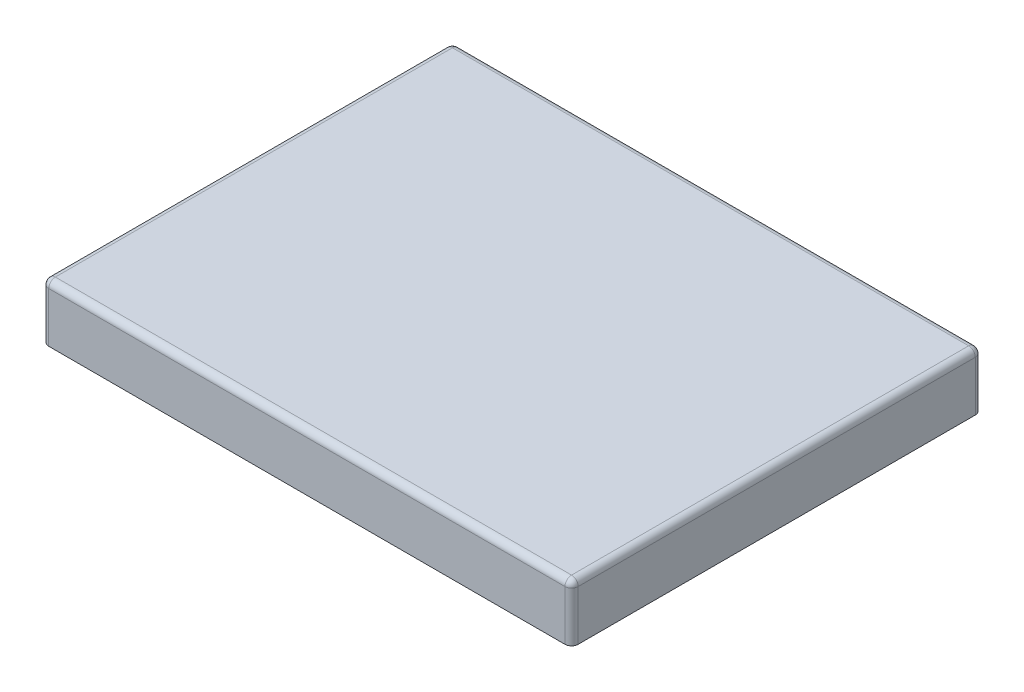
ISO-10303-21;
HEADER;
FILE_DESCRIPTION(('STEP AP214'),'2;1');
FILE_NAME('part.step','',(''),(''),'','','');
FILE_SCHEMA(('AUTOMOTIVE_DESIGN { 1 0 10303 214 1 1 1 1 }'));
ENDSEC;
DATA;
#1=APPLICATION_CONTEXT('core data for automotive mechanical design processes');
#2=APPLICATION_PROTOCOL_DEFINITION('international standard','automotive_design',2000,#1);
#3=PRODUCT_CONTEXT('',#1,'mechanical');
#4=PRODUCT('Part','Part','',(#3));
#5=PRODUCT_RELATED_PRODUCT_CATEGORY('part','',(#4));
#6=PRODUCT_DEFINITION_FORMATION('','',#4);
#7=PRODUCT_DEFINITION_CONTEXT('part definition',#1,'design');
#8=PRODUCT_DEFINITION('design','',#6,#7);
#9=PRODUCT_DEFINITION_SHAPE('','',#8);
#10=(LENGTH_UNIT() NAMED_UNIT(*) SI_UNIT(.MILLI.,.METRE.));
#11=(NAMED_UNIT(*) PLANE_ANGLE_UNIT() SI_UNIT($,.RADIAN.));
#12=(NAMED_UNIT(*) SI_UNIT($,.STERADIAN.) SOLID_ANGLE_UNIT());
#13=UNCERTAINTY_MEASURE_WITH_UNIT(LENGTH_MEASURE(1.E-05),#10,'distance_accuracy_value','');
#14=(GEOMETRIC_REPRESENTATION_CONTEXT(3) GLOBAL_UNCERTAINTY_ASSIGNED_CONTEXT((#13)) GLOBAL_UNIT_ASSIGNED_CONTEXT((#10,
#11,#12)) REPRESENTATION_CONTEXT('',''));
#15=CARTESIAN_POINT('',(0.,0.,0.));
#16=DIRECTION('',(0.,0.,1.));
#17=DIRECTION('',(1.,0.,0.));
#18=AXIS2_PLACEMENT_3D('',#15,#16,#17);
#19=CARTESIAN_POINT('',(0.,54.356,-393.7));
#20=DIRECTION('',(0.,-1.,0.));
#21=DIRECTION('',(0.,0.,-1.));
#22=AXIS2_PLACEMENT_3D('',#19,#20,#21);
#23=PLANE('',#22);
#24=DIRECTION('',(1.,0.,0.));
#25=VECTOR('',#24,1.);
#26=CARTESIAN_POINT('',(0.,54.356,-6.35000000000002));
#27=LINE('',#26,#25);
#28=CARTESIAN_POINT('',(6.35,54.356,-6.35000000000002));
#29=VERTEX_POINT('',#28);
#30=CARTESIAN_POINT('',(501.65,54.356,-6.35000000000002));
#31=VERTEX_POINT('',#30);
#32=EDGE_CURVE('E231',#29,#31,#27,.T.);
#33=ORIENTED_EDGE('',*,*,#32,.T.);
#34=DIRECTION('',(0.,0.,-1.));
#35=VECTOR('',#34,1.);
#36=CARTESIAN_POINT('',(501.65,54.356,-393.7));
#37=LINE('',#36,#35);
#38=CARTESIAN_POINT('',(501.65,54.356,-387.35));
#39=VERTEX_POINT('',#38);
#40=EDGE_CURVE('E233',#31,#39,#37,.T.);
#41=ORIENTED_EDGE('',*,*,#40,.T.);
#42=DIRECTION('',(-1.,0.,0.));
#43=VECTOR('',#42,1.);
#44=CARTESIAN_POINT('',(0.,54.356,-387.35));
#45=LINE('',#44,#43);
#46=CARTESIAN_POINT('',(6.35,54.356,-387.35));
#47=VERTEX_POINT('',#46);
#48=EDGE_CURVE('E227',#39,#47,#45,.T.);
#49=ORIENTED_EDGE('',*,*,#48,.T.);
#50=DIRECTION('',(0.,0.,1.));
#51=VECTOR('',#50,1.);
#52=CARTESIAN_POINT('',(6.35,54.356,-393.7));
#53=LINE('',#52,#51);
#54=EDGE_CURVE('E229',#47,#29,#53,.T.);
#55=ORIENTED_EDGE('',*,*,#54,.T.);
#56=EDGE_LOOP('',(#33,#41,#49,#55));
#57=FACE_BOUND('',#56,.T.);
#58=ADVANCED_FACE('F33',(#57),#23,.F.);
#59=CARTESIAN_POINT('',(0.,0.,-393.7));
#60=DIRECTION('',(0.,-1.,0.));
#61=DIRECTION('',(0.,0.,-1.));
#62=AXIS2_PLACEMENT_3D('',#59,#60,#61);
#63=PLANE('',#62);
#64=DIRECTION('',(-1.,0.,0.));
#65=VECTOR('',#64,1.);
#66=CARTESIAN_POINT('',(0.,0.,-393.7));
#67=LINE('',#66,#65);
#68=CARTESIAN_POINT('',(501.65,0.,-393.7));
#69=VERTEX_POINT('',#68);
#70=CARTESIAN_POINT('',(6.35,0.,-393.7));
#71=VERTEX_POINT('',#70);
#72=EDGE_CURVE('E187',#69,#71,#67,.T.);
#73=ORIENTED_EDGE('',*,*,#72,.F.);
#74=CARTESIAN_POINT('',(501.65,0.,-387.35));
#75=DIRECTION('',(0.,-1.,0.));
#76=DIRECTION('',(0.,0.,-1.));
#77=AXIS2_PLACEMENT_3D('',#74,#75,#76);
#78=CIRCLE('',#77,6.35);
#79=CARTESIAN_POINT('',(508.,0.,-387.35));
#80=VERTEX_POINT('',#79);
#81=EDGE_CURVE('E171',#69,#80,#78,.T.);
#82=ORIENTED_EDGE('',*,*,#81,.T.);
#83=DIRECTION('',(0.,0.,-1.));
#84=VECTOR('',#83,1.);
#85=CARTESIAN_POINT('',(508.,0.,0.));
#86=LINE('',#85,#84);
#87=CARTESIAN_POINT('',(508.,0.,-6.35));
#88=VERTEX_POINT('',#87);
#89=EDGE_CURVE('E200',#88,#80,#86,.T.);
#90=ORIENTED_EDGE('',*,*,#89,.F.);
#91=CARTESIAN_POINT('',(501.65,0.,-6.35));
#92=DIRECTION('',(0.,-1.,0.));
#93=DIRECTION('',(0.,0.,-1.));
#94=AXIS2_PLACEMENT_3D('',#91,#92,#93);
#95=CIRCLE('',#94,6.35);
#96=CARTESIAN_POINT('',(501.65,0.,0.));
#97=VERTEX_POINT('',#96);
#98=EDGE_CURVE('E182',#88,#97,#95,.T.);
#99=ORIENTED_EDGE('',*,*,#98,.T.);
#100=DIRECTION('',(1.,0.,0.));
#101=VECTOR('',#100,1.);
#102=CARTESIAN_POINT('',(0.,0.,0.));
#103=LINE('',#102,#101);
#104=CARTESIAN_POINT('',(6.35,0.,0.));
#105=VERTEX_POINT('',#104);
#106=EDGE_CURVE('E203',#105,#97,#103,.T.);
#107=ORIENTED_EDGE('',*,*,#106,.F.);
#108=CARTESIAN_POINT('',(6.35,0.,-6.35));
#109=DIRECTION('',(0.,-1.,0.));
#110=DIRECTION('',(0.,0.,-1.));
#111=AXIS2_PLACEMENT_3D('',#108,#109,#110);
#112=CIRCLE('',#111,6.35);
#113=CARTESIAN_POINT('',(0.,0.,-6.35));
#114=VERTEX_POINT('',#113);
#115=EDGE_CURVE('E192',#105,#114,#112,.T.);
#116=ORIENTED_EDGE('',*,*,#115,.T.);
#117=DIRECTION('',(0.,0.,1.));
#118=VECTOR('',#117,1.);
#119=CARTESIAN_POINT('',(0.,0.,0.));
#120=LINE('',#119,#118);
#121=CARTESIAN_POINT('',(0.,0.,-387.35));
#122=VERTEX_POINT('',#121);
#123=EDGE_CURVE('E366',#122,#114,#120,.T.);
#124=ORIENTED_EDGE('',*,*,#123,.F.);
#125=CARTESIAN_POINT('',(6.35,0.,-387.35));
#126=DIRECTION('',(0.,-1.,0.));
#127=DIRECTION('',(0.,0.,-1.));
#128=AXIS2_PLACEMENT_3D('',#125,#126,#127);
#129=CIRCLE('',#128,6.35);
#130=EDGE_CURVE('E199',#122,#71,#129,.T.);
#131=ORIENTED_EDGE('',*,*,#130,.T.);
#132=EDGE_LOOP('',(#73,#82,#90,#99,#107,#116,#124,#131));
#133=FACE_BOUND('',#132,.T.);
#134=DIRECTION('',(0.,0.,-1.));
#135=VECTOR('',#134,1.);
#136=CARTESIAN_POINT('',(493.7125,0.,-379.3998));
#137=LINE('',#136,#135);
#138=CARTESIAN_POINT('',(493.7125,0.,-20.6248000000001));
#139=VERTEX_POINT('',#138);
#140=CARTESIAN_POINT('',(493.7125,0.,-373.0498));
#141=VERTEX_POINT('',#140);
#142=EDGE_CURVE('E358',#139,#141,#137,.T.);
#143=ORIENTED_EDGE('',*,*,#142,.T.);
#144=CARTESIAN_POINT('',(487.3625,0.,-373.0498));
#145=DIRECTION('',(0.,-1.,0.));
#146=DIRECTION('',(0.,0.,-1.));
#147=AXIS2_PLACEMENT_3D('',#144,#145,#146);
#148=CIRCLE('',#147,6.35);
#149=CARTESIAN_POINT('',(487.3625,0.,-379.3998));
#150=VERTEX_POINT('',#149);
#151=EDGE_CURVE('E11',#141,#150,#148,.F.);
#152=ORIENTED_EDGE('',*,*,#151,.T.);
#153=DIRECTION('',(-1.,0.,0.));
#154=VECTOR('',#153,1.);
#155=CARTESIAN_POINT('',(14.2875,0.,-379.3998));
#156=LINE('',#155,#154);
#157=CARTESIAN_POINT('',(20.6375,0.,-379.3998));
#158=VERTEX_POINT('',#157);
#159=EDGE_CURVE('E360',#150,#158,#156,.T.);
#160=ORIENTED_EDGE('',*,*,#159,.T.);
#161=CARTESIAN_POINT('',(20.6375,0.,-373.0498));
#162=DIRECTION('',(0.,-1.,0.));
#163=DIRECTION('',(0.,0.,-1.));
#164=AXIS2_PLACEMENT_3D('',#161,#162,#163);
#165=CIRCLE('',#164,6.35);
#166=CARTESIAN_POINT('',(14.2875,0.,-373.0498));
#167=VERTEX_POINT('',#166);
#168=EDGE_CURVE('E303',#158,#167,#165,.F.);
#169=ORIENTED_EDGE('',*,*,#168,.T.);
#170=DIRECTION('',(0.,0.,1.));
#171=VECTOR('',#170,1.);
#172=CARTESIAN_POINT('',(14.2875,0.,-379.3998));
#173=LINE('',#172,#171);
#174=CARTESIAN_POINT('',(14.2875000000001,0.,-20.6248000000001));
#175=VERTEX_POINT('',#174);
#176=EDGE_CURVE('E271',#167,#175,#173,.T.);
#177=ORIENTED_EDGE('',*,*,#176,.T.);
#178=CARTESIAN_POINT('',(20.6375000000001,0.,-20.6248000000001));
#179=DIRECTION('',(0.,-1.,0.));
#180=DIRECTION('',(0.,0.,-1.));
#181=AXIS2_PLACEMENT_3D('',#178,#179,#180);
#182=CIRCLE('',#181,6.35);
#183=CARTESIAN_POINT('',(20.6375000000001,0.,-14.2748));
#184=VERTEX_POINT('',#183);
#185=EDGE_CURVE('E305',#175,#184,#182,.F.);
#186=ORIENTED_EDGE('',*,*,#185,.T.);
#187=DIRECTION('',(1.,0.,0.));
#188=VECTOR('',#187,1.);
#189=CARTESIAN_POINT('',(14.2875000000001,0.,-14.2748));
#190=LINE('',#189,#188);
#191=CARTESIAN_POINT('',(487.3625,0.,-14.2748));
#192=VERTEX_POINT('',#191);
#193=EDGE_CURVE('E353',#184,#192,#190,.T.);
#194=ORIENTED_EDGE('',*,*,#193,.T.);
#195=CARTESIAN_POINT('',(487.3625,0.,-20.6248));
#196=DIRECTION('',(0.,-1.,0.));
#197=DIRECTION('',(0.,0.,-1.));
#198=AXIS2_PLACEMENT_3D('',#195,#196,#197);
#199=CIRCLE('',#198,6.35);
#200=EDGE_CURVE('E42',#192,#139,#199,.F.);
#201=ORIENTED_EDGE('',*,*,#200,.T.);
#202=EDGE_LOOP('',(#143,#152,#160,#169,#177,#186,#194,#201));
#203=FACE_BOUND('',#202,.T.);
#204=ADVANCED_FACE('F195',(#133,#203),#63,.T.);
#205=CARTESIAN_POINT('',(0.,54.356,0.));
#206=DIRECTION('',(1.,0.,0.));
#207=DIRECTION('',(0.,0.,-1.));
#208=AXIS2_PLACEMENT_3D('',#205,#206,#207);
#209=PLANE('',#208);
#210=DIRECTION('',(0.,0.,1.));
#211=VECTOR('',#210,1.);
#212=CARTESIAN_POINT('',(0.,48.006,0.));
#213=LINE('',#212,#211);
#214=CARTESIAN_POINT('',(0.,48.006,-6.35));
#215=VERTEX_POINT('',#214);
#216=CARTESIAN_POINT('',(0.,48.006,-387.35));
#217=VERTEX_POINT('',#216);
#218=EDGE_CURVE('E221',#215,#217,#213,.F.);
#219=ORIENTED_EDGE('',*,*,#218,.T.);
#220=DIRECTION('',(0.,-1.,0.));
#221=VECTOR('',#220,1.);
#222=CARTESIAN_POINT('',(0.,54.356,-387.35));
#223=LINE('',#222,#221);
#224=EDGE_CURVE('E225',#217,#122,#223,.T.);
#225=ORIENTED_EDGE('',*,*,#224,.T.);
#226=ORIENTED_EDGE('',*,*,#123,.T.);
#227=DIRECTION('',(0.,-1.,0.));
#228=VECTOR('',#227,1.);
#229=CARTESIAN_POINT('',(0.,54.356,-6.35));
#230=LINE('',#229,#228);
#231=EDGE_CURVE('E223',#114,#215,#230,.F.);
#232=ORIENTED_EDGE('',*,*,#231,.T.);
#233=EDGE_LOOP('',(#219,#225,#226,#232));
#234=FACE_BOUND('',#233,.T.);
#235=ADVANCED_FACE('F404',(#234),#209,.F.);
#236=CARTESIAN_POINT('',(0.,54.356,0.));
#237=DIRECTION('',(0.,0.,-1.));
#238=DIRECTION('',(-1.,0.,0.));
#239=AXIS2_PLACEMENT_3D('',#236,#237,#238);
#240=PLANE('',#239);
#241=ORIENTED_EDGE('',*,*,#106,.T.);
#242=DIRECTION('',(0.,-1.,0.));
#243=VECTOR('',#242,1.);
#244=CARTESIAN_POINT('',(501.65,54.356,0.));
#245=LINE('',#244,#243);
#246=CARTESIAN_POINT('',(501.65,48.006,0.));
#247=VERTEX_POINT('',#246);
#248=EDGE_CURVE('E219',#97,#247,#245,.F.);
#249=ORIENTED_EDGE('',*,*,#248,.T.);
#250=DIRECTION('',(1.,0.,0.));
#251=VECTOR('',#250,1.);
#252=CARTESIAN_POINT('',(0.,48.006,0.));
#253=LINE('',#252,#251);
#254=CARTESIAN_POINT('',(6.35,48.006,0.));
#255=VERTEX_POINT('',#254);
#256=EDGE_CURVE('E215',#247,#255,#253,.F.);
#257=ORIENTED_EDGE('',*,*,#256,.T.);
#258=DIRECTION('',(0.,-1.,0.));
#259=VECTOR('',#258,1.);
#260=CARTESIAN_POINT('',(6.35,54.356,0.));
#261=LINE('',#260,#259);
#262=EDGE_CURVE('E217',#255,#105,#261,.T.);
#263=ORIENTED_EDGE('',*,*,#262,.T.);
#264=EDGE_LOOP('',(#241,#249,#257,#263));
#265=FACE_BOUND('',#264,.T.);
#266=ADVANCED_FACE('F372',(#265),#240,.F.);
#267=CARTESIAN_POINT('',(508.,54.356,0.));
#268=DIRECTION('',(-1.,0.,0.));
#269=DIRECTION('',(0.,0.,1.));
#270=AXIS2_PLACEMENT_3D('',#267,#268,#269);
#271=PLANE('',#270);
#272=ORIENTED_EDGE('',*,*,#89,.T.);
#273=DIRECTION('',(0.,-1.,0.));
#274=VECTOR('',#273,1.);
#275=CARTESIAN_POINT('',(508.,54.356,-387.35));
#276=LINE('',#275,#274);
#277=CARTESIAN_POINT('',(508.,48.006,-387.35));
#278=VERTEX_POINT('',#277);
#279=EDGE_CURVE('E176',#80,#278,#276,.F.);
#280=ORIENTED_EDGE('',*,*,#279,.T.);
#281=DIRECTION('',(0.,0.,-1.));
#282=VECTOR('',#281,1.);
#283=CARTESIAN_POINT('',(508.,48.006,0.));
#284=LINE('',#283,#282);
#285=CARTESIAN_POINT('',(508.,48.006,-6.35));
#286=VERTEX_POINT('',#285);
#287=EDGE_CURVE('E181',#278,#286,#284,.F.);
#288=ORIENTED_EDGE('',*,*,#287,.T.);
#289=DIRECTION('',(0.,-1.,0.));
#290=VECTOR('',#289,1.);
#291=CARTESIAN_POINT('',(508.,54.356,-6.35));
#292=LINE('',#291,#290);
#293=EDGE_CURVE('E212',#286,#88,#292,.T.);
#294=ORIENTED_EDGE('',*,*,#293,.T.);
#295=EDGE_LOOP('',(#272,#280,#288,#294));
#296=FACE_BOUND('',#295,.T.);
#297=ADVANCED_FACE('F422',(#296),#271,.F.);
#298=CARTESIAN_POINT('',(0.,54.356,-393.7));
#299=DIRECTION('',(0.,0.,1.));
#300=DIRECTION('',(1.,0.,0.));
#301=AXIS2_PLACEMENT_3D('',#298,#299,#300);
#302=PLANE('',#301);
#303=DIRECTION('',(-1.,0.,0.));
#304=VECTOR('',#303,1.);
#305=CARTESIAN_POINT('',(0.,48.006,-393.7));
#306=LINE('',#305,#304);
#307=CARTESIAN_POINT('',(6.35,48.006,-393.7));
#308=VERTEX_POINT('',#307);
#309=CARTESIAN_POINT('',(501.65,48.006,-393.7));
#310=VERTEX_POINT('',#309);
#311=EDGE_CURVE('E190',#308,#310,#306,.F.);
#312=ORIENTED_EDGE('',*,*,#311,.T.);
#313=DIRECTION('',(0.,-1.,0.));
#314=VECTOR('',#313,1.);
#315=CARTESIAN_POINT('',(501.65,54.356,-393.7));
#316=LINE('',#315,#314);
#317=EDGE_CURVE('E175',#310,#69,#316,.T.);
#318=ORIENTED_EDGE('',*,*,#317,.T.);
#319=ORIENTED_EDGE('',*,*,#72,.T.);
#320=DIRECTION('',(0.,-1.,0.));
#321=VECTOR('',#320,1.);
#322=CARTESIAN_POINT('',(6.35,54.356,-393.7));
#323=LINE('',#322,#321);
#324=EDGE_CURVE('E193',#71,#308,#323,.F.);
#325=ORIENTED_EDGE('',*,*,#324,.T.);
#326=EDGE_LOOP('',(#312,#318,#319,#325));
#327=FACE_BOUND('',#326,.T.);
#328=ADVANCED_FACE('F186',(#327),#302,.F.);
#329=CARTESIAN_POINT('',(14.2875,54.356,-379.3998));
#330=DIRECTION('',(1.,0.,0.));
#331=DIRECTION('',(0.,0.,-1.));
#332=AXIS2_PLACEMENT_3D('',#329,#330,#331);
#333=PLANE('',#332);
#334=ORIENTED_EDGE('',*,*,#176,.F.);
#335=DIRECTION('',(0.,-1.,0.));
#336=VECTOR('',#335,1.);
#337=CARTESIAN_POINT('',(14.2875,41.656,-373.0498));
#338=LINE('',#337,#336);
#339=CARTESIAN_POINT('',(14.2875,35.306,-373.0498));
#340=VERTEX_POINT('',#339);
#341=EDGE_CURVE('E282',#167,#340,#338,.F.);
#342=ORIENTED_EDGE('',*,*,#341,.T.);
#343=DIRECTION('',(0.,0.,-1.));
#344=VECTOR('',#343,1.);
#345=CARTESIAN_POINT('',(14.2875000000001,35.306,-14.2748));
#346=LINE('',#345,#344);
#347=CARTESIAN_POINT('',(14.2875000000001,35.306,-20.6248000000001));
#348=VERTEX_POINT('',#347);
#349=EDGE_CURVE('E280',#340,#348,#346,.F.);
#350=ORIENTED_EDGE('',*,*,#349,.T.);
#351=DIRECTION('',(0.,-1.,0.));
#352=VECTOR('',#351,1.);
#353=CARTESIAN_POINT('',(14.2875000000001,0.,-20.6248000000001));
#354=LINE('',#353,#352);
#355=EDGE_CURVE('E278',#348,#175,#354,.T.);
#356=ORIENTED_EDGE('',*,*,#355,.T.);
#357=EDGE_LOOP('',(#334,#342,#350,#356));
#358=FACE_BOUND('',#357,.T.);
#359=ADVANCED_FACE('F429',(#358),#333,.T.);
#360=CARTESIAN_POINT('',(14.2875000000001,54.356,-14.2748));
#361=DIRECTION('',(0.,0.,-1.));
#362=DIRECTION('',(-1.,0.,0.));
#363=AXIS2_PLACEMENT_3D('',#360,#361,#362);
#364=PLANE('',#363);
#365=ORIENTED_EDGE('',*,*,#193,.F.);
#366=DIRECTION('',(0.,-1.,0.));
#367=VECTOR('',#366,1.);
#368=CARTESIAN_POINT('',(20.6375000000001,41.656,-14.2748));
#369=LINE('',#368,#367);
#370=CARTESIAN_POINT('',(20.6375000000001,35.306,-14.2748));
#371=VERTEX_POINT('',#370);
#372=EDGE_CURVE('E297',#184,#371,#369,.F.);
#373=ORIENTED_EDGE('',*,*,#372,.T.);
#374=DIRECTION('',(-1.,0.,0.));
#375=VECTOR('',#374,1.);
#376=CARTESIAN_POINT('',(493.7125,35.306,-14.2748));
#377=LINE('',#376,#375);
#378=CARTESIAN_POINT('',(487.3625,35.306,-14.2748));
#379=VERTEX_POINT('',#378);
#380=EDGE_CURVE('E295',#371,#379,#377,.F.);
#381=ORIENTED_EDGE('',*,*,#380,.T.);
#382=DIRECTION('',(0.,-1.,0.));
#383=VECTOR('',#382,1.);
#384=CARTESIAN_POINT('',(487.3625,0.,-14.2748));
#385=LINE('',#384,#383);
#386=EDGE_CURVE('E293',#379,#192,#385,.T.);
#387=ORIENTED_EDGE('',*,*,#386,.T.);
#388=EDGE_LOOP('',(#365,#373,#381,#387));
#389=FACE_BOUND('',#388,.T.);
#390=ADVANCED_FACE('F352',(#389),#364,.T.);
#391=CARTESIAN_POINT('',(493.7125,54.356,-379.3998));
#392=DIRECTION('',(-1.,0.,0.));
#393=DIRECTION('',(0.,0.,1.));
#394=AXIS2_PLACEMENT_3D('',#391,#392,#393);
#395=PLANE('',#394);
#396=ORIENTED_EDGE('',*,*,#142,.F.);
#397=DIRECTION('',(0.,-1.,0.));
#398=VECTOR('',#397,1.);
#399=CARTESIAN_POINT('',(493.7125,41.656,-20.6248));
#400=LINE('',#399,#398);
#401=CARTESIAN_POINT('',(493.7125,35.306,-20.6248));
#402=VERTEX_POINT('',#401);
#403=EDGE_CURVE('E50',#139,#402,#400,.F.);
#404=ORIENTED_EDGE('',*,*,#403,.T.);
#405=DIRECTION('',(0.,0.,1.));
#406=VECTOR('',#405,1.);
#407=CARTESIAN_POINT('',(493.7125,35.306,-379.3998));
#408=LINE('',#407,#406);
#409=CARTESIAN_POINT('',(493.7125,35.306,-373.0498));
#410=VERTEX_POINT('',#409);
#411=EDGE_CURVE('E55',#402,#410,#408,.F.);
#412=ORIENTED_EDGE('',*,*,#411,.T.);
#413=DIRECTION('',(0.,-1.,0.));
#414=VECTOR('',#413,1.);
#415=CARTESIAN_POINT('',(493.7125,0.,-373.0498));
#416=LINE('',#415,#414);
#417=EDGE_CURVE('E299',#410,#141,#416,.T.);
#418=ORIENTED_EDGE('',*,*,#417,.T.);
#419=EDGE_LOOP('',(#396,#404,#412,#418));
#420=FACE_BOUND('',#419,.T.);
#421=ADVANCED_FACE('F445',(#420),#395,.T.);
#422=CARTESIAN_POINT('',(14.2875,54.356,-379.3998));
#423=DIRECTION('',(0.,0.,1.));
#424=DIRECTION('',(1.,0.,0.));
#425=AXIS2_PLACEMENT_3D('',#422,#423,#424);
#426=PLANE('',#425);
#427=DIRECTION('',(1.,0.,0.));
#428=VECTOR('',#427,1.);
#429=CARTESIAN_POINT('',(14.2875,35.306,-379.3998));
#430=LINE('',#429,#428);
#431=CARTESIAN_POINT('',(487.3625,35.306,-379.3998));
#432=VERTEX_POINT('',#431);
#433=CARTESIAN_POINT('',(20.6375,35.306,-379.3998));
#434=VERTEX_POINT('',#433);
#435=EDGE_CURVE('E273',#432,#434,#430,.F.);
#436=ORIENTED_EDGE('',*,*,#435,.T.);
#437=DIRECTION('',(0.,-1.,0.));
#438=VECTOR('',#437,1.);
#439=CARTESIAN_POINT('',(20.6375,0.,-379.3998));
#440=LINE('',#439,#438);
#441=EDGE_CURVE('E275',#434,#158,#440,.T.);
#442=ORIENTED_EDGE('',*,*,#441,.T.);
#443=ORIENTED_EDGE('',*,*,#159,.F.);
#444=DIRECTION('',(0.,-1.,0.));
#445=VECTOR('',#444,1.);
#446=CARTESIAN_POINT('',(487.3625,41.656,-379.3998));
#447=LINE('',#446,#445);
#448=EDGE_CURVE('E236',#150,#432,#447,.F.);
#449=ORIENTED_EDGE('',*,*,#448,.T.);
#450=EDGE_LOOP('',(#436,#442,#443,#449));
#451=FACE_BOUND('',#450,.T.);
#452=ADVANCED_FACE('F448',(#451),#426,.T.);
#453=CARTESIAN_POINT('',(0.,41.656,0.));
#454=DIRECTION('',(0.,-1.,0.));
#455=DIRECTION('',(0.,0.,-1.));
#456=AXIS2_PLACEMENT_3D('',#453,#454,#455);
#457=PLANE('',#456);
#458=DIRECTION('',(-1.,0.,0.));
#459=VECTOR('',#458,1.);
#460=CARTESIAN_POINT('',(14.2875000000001,41.656,-20.6248));
#461=LINE('',#460,#459);
#462=CARTESIAN_POINT('',(487.3625,41.656,-20.6248));
#463=VERTEX_POINT('',#462);
#464=CARTESIAN_POINT('',(20.6375000000001,41.656,-20.6248));
#465=VERTEX_POINT('',#464);
#466=EDGE_CURVE('E288',#463,#465,#461,.T.);
#467=ORIENTED_EDGE('',*,*,#466,.T.);
#468=DIRECTION('',(0.,0.,-1.));
#469=VECTOR('',#468,1.);
#470=CARTESIAN_POINT('',(20.6375,41.656,-379.3998));
#471=LINE('',#470,#469);
#472=CARTESIAN_POINT('',(20.6375,41.656,-373.0498));
#473=VERTEX_POINT('',#472);
#474=EDGE_CURVE('E290',#465,#473,#471,.T.);
#475=ORIENTED_EDGE('',*,*,#474,.T.);
#476=DIRECTION('',(1.,0.,0.));
#477=VECTOR('',#476,1.);
#478=CARTESIAN_POINT('',(493.7125,41.656,-373.0498));
#479=LINE('',#478,#477);
#480=CARTESIAN_POINT('',(487.3625,41.656,-373.0498));
#481=VERTEX_POINT('',#480);
#482=EDGE_CURVE('E284',#473,#481,#479,.T.);
#483=ORIENTED_EDGE('',*,*,#482,.T.);
#484=DIRECTION('',(0.,0.,1.));
#485=VECTOR('',#484,1.);
#486=CARTESIAN_POINT('',(487.3625,41.656,-14.2748));
#487=LINE('',#486,#485);
#488=EDGE_CURVE('E286',#481,#463,#487,.T.);
#489=ORIENTED_EDGE('',*,*,#488,.T.);
#490=EDGE_LOOP('',(#467,#475,#483,#489));
#491=FACE_BOUND('',#490,.T.);
#492=ADVANCED_FACE('F451',(#491),#457,.T.);
#493=CARTESIAN_POINT('',(6.35,54.356,-6.35));
#494=DIRECTION('',(0.,-1.,0.));
#495=DIRECTION('',(0.,0.,-1.));
#496=AXIS2_PLACEMENT_3D('',#493,#494,#495);
#497=CYLINDRICAL_SURFACE('',#496,6.35);
#498=CARTESIAN_POINT('',(6.35,48.006,-6.35));
#499=DIRECTION('',(0.,1.,0.));
#500=DIRECTION('',(0.,0.,1.));
#501=AXIS2_PLACEMENT_3D('',#498,#499,#500);
#502=CIRCLE('',#501,6.35);
#503=EDGE_CURVE('E268',#215,#255,#502,.T.);
#504=ORIENTED_EDGE('',*,*,#503,.F.);
#505=ORIENTED_EDGE('',*,*,#231,.F.);
#506=ORIENTED_EDGE('',*,*,#115,.F.);
#507=ORIENTED_EDGE('',*,*,#262,.F.);
#508=EDGE_LOOP('',(#504,#505,#506,#507));
#509=FACE_BOUND('',#508,.T.);
#510=ADVANCED_FACE('F392',(#509),#497,.T.);
#511=CARTESIAN_POINT('',(6.35,48.006,-6.35));
#512=DIRECTION('',(0.,0.,1.));
#513=DIRECTION('',(1.,0.,0.));
#514=AXIS2_PLACEMENT_3D('',#511,#512,#513);
#515=SPHERICAL_SURFACE('',#514,6.35);
#516=CARTESIAN_POINT('',(6.35,48.006,-6.35000000000002));
#517=DIRECTION('',(0.,0.,1.));
#518=DIRECTION('',(1.,0.,0.));
#519=AXIS2_PLACEMENT_3D('',#516,#517,#518);
#520=CIRCLE('',#519,6.35);
#521=EDGE_CURVE('E262',#215,#29,#520,.F.);
#522=ORIENTED_EDGE('',*,*,#521,.F.);
#523=ORIENTED_EDGE('',*,*,#503,.T.);
#524=CARTESIAN_POINT('',(6.35,48.006,-6.35));
#525=DIRECTION('',(-1.,0.,0.));
#526=DIRECTION('',(0.,0.,1.));
#527=AXIS2_PLACEMENT_3D('',#524,#525,#526);
#528=CIRCLE('',#527,6.35);
#529=EDGE_CURVE('E265',#29,#255,#528,.F.);
#530=ORIENTED_EDGE('',*,*,#529,.F.);
#531=EDGE_LOOP('',(#522,#523,#530));
#532=FACE_BOUND('',#531,.T.);
#533=ADVANCED_FACE('F396',(#532),#515,.T.);
#534=CARTESIAN_POINT('',(501.65,54.356,-6.35));
#535=DIRECTION('',(0.,-1.,0.));
#536=DIRECTION('',(0.,0.,-1.));
#537=AXIS2_PLACEMENT_3D('',#534,#535,#536);
#538=CYLINDRICAL_SURFACE('',#537,6.35);
#539=ORIENTED_EDGE('',*,*,#98,.F.);
#540=ORIENTED_EDGE('',*,*,#293,.F.);
#541=CARTESIAN_POINT('',(501.65,48.006,-6.35));
#542=DIRECTION('',(0.,1.,0.));
#543=DIRECTION('',(0.,0.,1.));
#544=AXIS2_PLACEMENT_3D('',#541,#542,#543);
#545=CIRCLE('',#544,6.35);
#546=EDGE_CURVE('E259',#247,#286,#545,.T.);
#547=ORIENTED_EDGE('',*,*,#546,.F.);
#548=ORIENTED_EDGE('',*,*,#248,.F.);
#549=EDGE_LOOP('',(#539,#540,#547,#548));
#550=FACE_BOUND('',#549,.T.);
#551=ADVANCED_FACE('F379',(#550),#538,.T.);
#552=CARTESIAN_POINT('',(0.,48.006,-6.35000000000002));
#553=DIRECTION('',(1.,0.,0.));
#554=DIRECTION('',(0.,0.,-1.));
#555=AXIS2_PLACEMENT_3D('',#552,#553,#554);
#556=CYLINDRICAL_SURFACE('',#555,6.35);
#557=ORIENTED_EDGE('',*,*,#529,.T.);
#558=ORIENTED_EDGE('',*,*,#256,.F.);
#559=CARTESIAN_POINT('',(501.65,48.006,-6.35000000000002));
#560=DIRECTION('',(1.,0.,0.));
#561=DIRECTION('',(0.,0.,-1.));
#562=AXIS2_PLACEMENT_3D('',#559,#560,#561);
#563=CIRCLE('',#562,6.35);
#564=EDGE_CURVE('E256',#31,#247,#563,.T.);
#565=ORIENTED_EDGE('',*,*,#564,.F.);
#566=ORIENTED_EDGE('',*,*,#32,.F.);
#567=EDGE_LOOP('',(#557,#558,#565,#566));
#568=FACE_BOUND('',#567,.T.);
#569=ADVANCED_FACE('F388',(#568),#556,.T.);
#570=CARTESIAN_POINT('',(6.35,48.006,-393.7));
#571=DIRECTION('',(0.,0.,1.));
#572=DIRECTION('',(1.,0.,0.));
#573=AXIS2_PLACEMENT_3D('',#570,#571,#572);
#574=CYLINDRICAL_SURFACE('',#573,6.35);
#575=ORIENTED_EDGE('',*,*,#521,.T.);
#576=ORIENTED_EDGE('',*,*,#54,.F.);
#577=CARTESIAN_POINT('',(6.35,48.006,-387.35));
#578=DIRECTION('',(0.,0.,-1.));
#579=DIRECTION('',(-1.,0.,0.));
#580=AXIS2_PLACEMENT_3D('',#577,#578,#579);
#581=CIRCLE('',#580,6.35);
#582=EDGE_CURVE('E253',#217,#47,#581,.T.);
#583=ORIENTED_EDGE('',*,*,#582,.F.);
#584=ORIENTED_EDGE('',*,*,#218,.F.);
#585=EDGE_LOOP('',(#575,#576,#583,#584));
#586=FACE_BOUND('',#585,.T.);
#587=ADVANCED_FACE('F401',(#586),#574,.T.);
#588=CARTESIAN_POINT('',(6.35,54.356,-387.35));
#589=DIRECTION('',(0.,-1.,0.));
#590=DIRECTION('',(0.,0.,-1.));
#591=AXIS2_PLACEMENT_3D('',#588,#589,#590);
#592=CYLINDRICAL_SURFACE('',#591,6.35);
#593=ORIENTED_EDGE('',*,*,#130,.F.);
#594=ORIENTED_EDGE('',*,*,#224,.F.);
#595=CARTESIAN_POINT('',(6.35,48.006,-387.35));
#596=DIRECTION('',(0.,1.,0.));
#597=DIRECTION('',(0.,0.,1.));
#598=AXIS2_PLACEMENT_3D('',#595,#596,#597);
#599=CIRCLE('',#598,6.35);
#600=EDGE_CURVE('E250',#308,#217,#599,.T.);
#601=ORIENTED_EDGE('',*,*,#600,.F.);
#602=ORIENTED_EDGE('',*,*,#324,.F.);
#603=EDGE_LOOP('',(#593,#594,#601,#602));
#604=FACE_BOUND('',#603,.T.);
#605=ADVANCED_FACE('F407',(#604),#592,.T.);
#606=CARTESIAN_POINT('',(501.65,48.006,-6.35));
#607=DIRECTION('',(0.,0.,1.));
#608=DIRECTION('',(1.,0.,0.));
#609=AXIS2_PLACEMENT_3D('',#606,#607,#608);
#610=SPHERICAL_SURFACE('',#609,6.35);
#611=ORIENTED_EDGE('',*,*,#564,.T.);
#612=ORIENTED_EDGE('',*,*,#546,.T.);
#613=CARTESIAN_POINT('',(501.65,48.006,-6.35));
#614=DIRECTION('',(0.,0.,1.));
#615=DIRECTION('',(0.,-1.,0.));
#616=AXIS2_PLACEMENT_3D('',#613,#614,#615);
#617=CIRCLE('',#616,6.35);
#618=EDGE_CURVE('E247',#31,#286,#617,.F.);
#619=ORIENTED_EDGE('',*,*,#618,.F.);
#620=EDGE_LOOP('',(#611,#612,#619));
#621=FACE_BOUND('',#620,.T.);
#622=ADVANCED_FACE('F384',(#621),#610,.T.);
#623=CARTESIAN_POINT('',(6.35,48.006,-387.35));
#624=DIRECTION('',(0.,0.,1.));
#625=DIRECTION('',(1.,0.,0.));
#626=AXIS2_PLACEMENT_3D('',#623,#624,#625);
#627=SPHERICAL_SURFACE('',#626,6.35);
#628=ORIENTED_EDGE('',*,*,#600,.T.);
#629=ORIENTED_EDGE('',*,*,#582,.T.);
#630=CARTESIAN_POINT('',(6.35,48.006,-387.35));
#631=DIRECTION('',(-1.,0.,0.));
#632=DIRECTION('',(0.,0.,1.));
#633=AXIS2_PLACEMENT_3D('',#630,#631,#632);
#634=CIRCLE('',#633,6.35);
#635=EDGE_CURVE('E244',#308,#47,#634,.F.);
#636=ORIENTED_EDGE('',*,*,#635,.F.);
#637=EDGE_LOOP('',(#628,#629,#636));
#638=FACE_BOUND('',#637,.T.);
#639=ADVANCED_FACE('F410',(#638),#627,.T.);
#640=CARTESIAN_POINT('',(501.65,48.006,-393.7));
#641=DIRECTION('',(0.,0.,-1.));
#642=DIRECTION('',(-1.,0.,0.));
#643=AXIS2_PLACEMENT_3D('',#640,#641,#642);
#644=CYLINDRICAL_SURFACE('',#643,6.35);
#645=ORIENTED_EDGE('',*,*,#618,.T.);
#646=ORIENTED_EDGE('',*,*,#287,.F.);
#647=CARTESIAN_POINT('',(501.65,48.006,-387.35));
#648=DIRECTION('',(0.,0.,-1.));
#649=DIRECTION('',(-1.,0.,0.));
#650=AXIS2_PLACEMENT_3D('',#647,#648,#649);
#651=CIRCLE('',#650,6.35);
#652=EDGE_CURVE('E241',#39,#278,#651,.T.);
#653=ORIENTED_EDGE('',*,*,#652,.F.);
#654=ORIENTED_EDGE('',*,*,#40,.F.);
#655=EDGE_LOOP('',(#645,#646,#653,#654));
#656=FACE_BOUND('',#655,.T.);
#657=ADVANCED_FACE('F420',(#656),#644,.T.);
#658=CARTESIAN_POINT('',(0.,48.006,-387.35));
#659=DIRECTION('',(-1.,0.,0.));
#660=DIRECTION('',(0.,0.,1.));
#661=AXIS2_PLACEMENT_3D('',#658,#659,#660);
#662=CYLINDRICAL_SURFACE('',#661,6.35);
#663=ORIENTED_EDGE('',*,*,#635,.T.);
#664=ORIENTED_EDGE('',*,*,#48,.F.);
#665=CARTESIAN_POINT('',(501.65,48.006,-387.35));
#666=DIRECTION('',(1.,0.,0.));
#667=DIRECTION('',(0.,0.,-1.));
#668=AXIS2_PLACEMENT_3D('',#665,#666,#667);
#669=CIRCLE('',#668,6.35);
#670=EDGE_CURVE('E239',#310,#39,#669,.T.);
#671=ORIENTED_EDGE('',*,*,#670,.F.);
#672=ORIENTED_EDGE('',*,*,#311,.F.);
#673=EDGE_LOOP('',(#663,#664,#671,#672));
#674=FACE_BOUND('',#673,.T.);
#675=ADVANCED_FACE('F413',(#674),#662,.T.);
#676=CARTESIAN_POINT('',(501.65,48.006,-387.35));
#677=DIRECTION('',(0.,0.,1.));
#678=DIRECTION('',(1.,0.,0.));
#679=AXIS2_PLACEMENT_3D('',#676,#677,#678);
#680=SPHERICAL_SURFACE('',#679,6.35);
#681=ORIENTED_EDGE('',*,*,#670,.T.);
#682=ORIENTED_EDGE('',*,*,#652,.T.);
#683=CARTESIAN_POINT('',(501.65,48.006,-387.35));
#684=DIRECTION('',(0.,1.,0.));
#685=DIRECTION('',(0.,0.,1.));
#686=AXIS2_PLACEMENT_3D('',#683,#684,#685);
#687=CIRCLE('',#686,6.35);
#688=EDGE_CURVE('E237',#310,#278,#687,.F.);
#689=ORIENTED_EDGE('',*,*,#688,.F.);
#690=EDGE_LOOP('',(#681,#682,#689));
#691=FACE_BOUND('',#690,.T.);
#692=ADVANCED_FACE('F417',(#691),#680,.T.);
#693=CARTESIAN_POINT('',(501.65,54.356,-387.35));
#694=DIRECTION('',(0.,-1.,0.));
#695=DIRECTION('',(0.,0.,-1.));
#696=AXIS2_PLACEMENT_3D('',#693,#694,#695);
#697=CYLINDRICAL_SURFACE('',#696,6.35);
#698=ORIENTED_EDGE('',*,*,#688,.T.);
#699=ORIENTED_EDGE('',*,*,#279,.F.);
#700=ORIENTED_EDGE('',*,*,#81,.F.);
#701=ORIENTED_EDGE('',*,*,#317,.F.);
#702=EDGE_LOOP('',(#698,#699,#700,#701));
#703=FACE_BOUND('',#702,.T.);
#704=ADVANCED_FACE('F174',(#703),#697,.T.);
#705=CARTESIAN_POINT('',(487.3625,54.356,-20.6248));
#706=DIRECTION('',(0.,1.,0.));
#707=DIRECTION('',(0.,0.,1.));
#708=AXIS2_PLACEMENT_3D('',#705,#706,#707);
#709=CYLINDRICAL_SURFACE('',#708,6.35);
#710=CARTESIAN_POINT('',(487.3625,35.306,-20.6248));
#711=DIRECTION('',(0.,-1.,0.));
#712=DIRECTION('',(0.,0.,-1.));
#713=AXIS2_PLACEMENT_3D('',#710,#711,#712);
#714=CIRCLE('',#713,6.35);
#715=EDGE_CURVE('E37',#402,#379,#714,.T.);
#716=ORIENTED_EDGE('',*,*,#715,.F.);
#717=ORIENTED_EDGE('',*,*,#403,.F.);
#718=ORIENTED_EDGE('',*,*,#200,.F.);
#719=ORIENTED_EDGE('',*,*,#386,.F.);
#720=EDGE_LOOP('',(#716,#717,#718,#719));
#721=FACE_BOUND('',#720,.T.);
#722=ADVANCED_FACE('F35',(#721),#709,.F.);
#723=CARTESIAN_POINT('',(487.3625,35.306,-20.6248));
#724=DIRECTION('',(0.,0.,1.));
#725=DIRECTION('',(1.,0.,0.));
#726=AXIS2_PLACEMENT_3D('',#723,#724,#725);
#727=SPHERICAL_SURFACE('',#726,6.35);
#728=CARTESIAN_POINT('',(487.3625,35.306,-20.6248));
#729=DIRECTION('',(0.,0.,-1.));
#730=DIRECTION('',(-1.,0.,0.));
#731=AXIS2_PLACEMENT_3D('',#728,#729,#730);
#732=CIRCLE('',#731,6.35);
#733=EDGE_CURVE('E334',#402,#463,#732,.F.);
#734=ORIENTED_EDGE('',*,*,#733,.F.);
#735=ORIENTED_EDGE('',*,*,#715,.T.);
#736=CARTESIAN_POINT('',(487.3625,35.306,-20.6248));
#737=DIRECTION('',(-1.,0.,0.));
#738=DIRECTION('',(0.,0.,1.));
#739=AXIS2_PLACEMENT_3D('',#736,#737,#738);
#740=CIRCLE('',#739,6.35);
#741=EDGE_CURVE('E336',#463,#379,#740,.F.);
#742=ORIENTED_EDGE('',*,*,#741,.F.);
#743=EDGE_LOOP('',(#734,#735,#742));
#744=FACE_BOUND('',#743,.T.);
#745=ADVANCED_FACE('F345',(#744),#727,.F.);
#746=CARTESIAN_POINT('',(20.6375000000001,54.356,-20.6248000000001));
#747=DIRECTION('',(0.,1.,0.));
#748=DIRECTION('',(0.,0.,1.));
#749=AXIS2_PLACEMENT_3D('',#746,#747,#748);
#750=CYLINDRICAL_SURFACE('',#749,6.35);
#751=ORIENTED_EDGE('',*,*,#185,.F.);
#752=ORIENTED_EDGE('',*,*,#355,.F.);
#753=CARTESIAN_POINT('',(20.6375000000001,35.306,-20.6248));
#754=DIRECTION('',(0.,-1.,0.));
#755=DIRECTION('',(0.,0.,-1.));
#756=AXIS2_PLACEMENT_3D('',#753,#754,#755);
#757=CIRCLE('',#756,6.35);
#758=EDGE_CURVE('E331',#371,#348,#757,.T.);
#759=ORIENTED_EDGE('',*,*,#758,.F.);
#760=ORIENTED_EDGE('',*,*,#372,.F.);
#761=EDGE_LOOP('',(#751,#752,#759,#760));
#762=FACE_BOUND('',#761,.T.);
#763=ADVANCED_FACE('F497',(#762),#750,.F.);
#764=CARTESIAN_POINT('',(0.,35.306,-20.6248));
#765=DIRECTION('',(1.,0.,0.));
#766=DIRECTION('',(0.,0.,-1.));
#767=AXIS2_PLACEMENT_3D('',#764,#765,#766);
#768=CYLINDRICAL_SURFACE('',#767,6.35);
#769=ORIENTED_EDGE('',*,*,#741,.T.);
#770=ORIENTED_EDGE('',*,*,#380,.F.);
#771=CARTESIAN_POINT('',(20.6375000000001,35.306,-20.6248));
#772=DIRECTION('',(1.,0.,0.));
#773=DIRECTION('',(0.,0.,-1.));
#774=AXIS2_PLACEMENT_3D('',#771,#772,#773);
#775=CIRCLE('',#774,6.35);
#776=EDGE_CURVE('E328',#465,#371,#775,.T.);
#777=ORIENTED_EDGE('',*,*,#776,.F.);
#778=ORIENTED_EDGE('',*,*,#466,.F.);
#779=EDGE_LOOP('',(#769,#770,#777,#778));
#780=FACE_BOUND('',#779,.T.);
#781=ADVANCED_FACE('F463',(#780),#768,.F.);
#782=CARTESIAN_POINT('',(487.3625,35.306,-1.55531661277123E-13));
#783=DIRECTION('',(0.,0.,-1.));
#784=DIRECTION('',(-1.,0.,0.));
#785=AXIS2_PLACEMENT_3D('',#782,#783,#784);
#786=CYLINDRICAL_SURFACE('',#785,6.35);
#787=ORIENTED_EDGE('',*,*,#733,.T.);
#788=ORIENTED_EDGE('',*,*,#488,.F.);
#789=CARTESIAN_POINT('',(487.3625,35.306,-373.0498));
#790=DIRECTION('',(0.,0.,1.));
#791=DIRECTION('',(1.,0.,0.));
#792=AXIS2_PLACEMENT_3D('',#789,#790,#791);
#793=CIRCLE('',#792,6.35);
#794=EDGE_CURVE('E325',#410,#481,#793,.T.);
#795=ORIENTED_EDGE('',*,*,#794,.F.);
#796=ORIENTED_EDGE('',*,*,#411,.F.);
#797=EDGE_LOOP('',(#787,#788,#795,#796));
#798=FACE_BOUND('',#797,.T.);
#799=ADVANCED_FACE('F481',(#798),#786,.F.);
#800=CARTESIAN_POINT('',(487.3625,54.356,-373.0498));
#801=DIRECTION('',(0.,1.,0.));
#802=DIRECTION('',(0.,0.,1.));
#803=AXIS2_PLACEMENT_3D('',#800,#801,#802);
#804=CYLINDRICAL_SURFACE('',#803,6.35);
#805=ORIENTED_EDGE('',*,*,#151,.F.);
#806=ORIENTED_EDGE('',*,*,#417,.F.);
#807=CARTESIAN_POINT('',(487.3625,35.306,-373.0498));
#808=DIRECTION('',(0.,-1.,0.));
#809=DIRECTION('',(0.,0.,-1.));
#810=AXIS2_PLACEMENT_3D('',#807,#808,#809);
#811=CIRCLE('',#810,6.35);
#812=EDGE_CURVE('E322',#432,#410,#811,.T.);
#813=ORIENTED_EDGE('',*,*,#812,.F.);
#814=ORIENTED_EDGE('',*,*,#448,.F.);
#815=EDGE_LOOP('',(#805,#806,#813,#814));
#816=FACE_BOUND('',#815,.T.);
#817=ADVANCED_FACE('F488',(#816),#804,.F.);
#818=CARTESIAN_POINT('',(20.6375000000001,35.306,-20.6248));
#819=DIRECTION('',(0.,0.,1.));
#820=DIRECTION('',(1.,0.,0.));
#821=AXIS2_PLACEMENT_3D('',#818,#819,#820);
#822=SPHERICAL_SURFACE('',#821,6.35);
#823=ORIENTED_EDGE('',*,*,#776,.T.);
#824=ORIENTED_EDGE('',*,*,#758,.T.);
#825=CARTESIAN_POINT('',(20.6375000000001,35.306,-20.6248000000001));
#826=DIRECTION('',(0.,0.,-1.));
#827=DIRECTION('',(0.,1.,0.));
#828=AXIS2_PLACEMENT_3D('',#825,#826,#827);
#829=CIRCLE('',#828,6.35);
#830=EDGE_CURVE('E319',#465,#348,#829,.F.);
#831=ORIENTED_EDGE('',*,*,#830,.F.);
#832=EDGE_LOOP('',(#823,#824,#831));
#833=FACE_BOUND('',#832,.T.);
#834=ADVANCED_FACE('F466',(#833),#822,.F.);
#835=CARTESIAN_POINT('',(487.3625,35.306,-373.0498));
#836=DIRECTION('',(0.,0.,1.));
#837=DIRECTION('',(1.,0.,0.));
#838=AXIS2_PLACEMENT_3D('',#835,#836,#837);
#839=SPHERICAL_SURFACE('',#838,6.35);
#840=ORIENTED_EDGE('',*,*,#812,.T.);
#841=ORIENTED_EDGE('',*,*,#794,.T.);
#842=CARTESIAN_POINT('',(487.3625,35.306,-373.0498));
#843=DIRECTION('',(-1.,0.,0.));
#844=DIRECTION('',(0.,0.,1.));
#845=AXIS2_PLACEMENT_3D('',#842,#843,#844);
#846=CIRCLE('',#845,6.35);
#847=EDGE_CURVE('E316',#432,#481,#846,.F.);
#848=ORIENTED_EDGE('',*,*,#847,.F.);
#849=EDGE_LOOP('',(#840,#841,#848));
#850=FACE_BOUND('',#849,.T.);
#851=ADVANCED_FACE('F483',(#850),#839,.F.);
#852=CARTESIAN_POINT('',(20.6375000000001,35.306,0.));
#853=DIRECTION('',(0.,0.,1.));
#854=DIRECTION('',(1.,0.,0.));
#855=AXIS2_PLACEMENT_3D('',#852,#853,#854);
#856=CYLINDRICAL_SURFACE('',#855,6.35);
#857=ORIENTED_EDGE('',*,*,#830,.T.);
#858=ORIENTED_EDGE('',*,*,#349,.F.);
#859=CARTESIAN_POINT('',(20.6375,35.306,-373.0498));
#860=DIRECTION('',(0.,0.,1.));
#861=DIRECTION('',(1.,0.,0.));
#862=AXIS2_PLACEMENT_3D('',#859,#860,#861);
#863=CIRCLE('',#862,6.35);
#864=EDGE_CURVE('E313',#473,#340,#863,.T.);
#865=ORIENTED_EDGE('',*,*,#864,.F.);
#866=ORIENTED_EDGE('',*,*,#474,.F.);
#867=EDGE_LOOP('',(#857,#858,#865,#866));
#868=FACE_BOUND('',#867,.T.);
#869=ADVANCED_FACE('F470',(#868),#856,.F.);
#870=CARTESIAN_POINT('',(0.,35.306,-373.0498));
#871=DIRECTION('',(-1.,0.,0.));
#872=DIRECTION('',(0.,0.,1.));
#873=AXIS2_PLACEMENT_3D('',#870,#871,#872);
#874=CYLINDRICAL_SURFACE('',#873,6.35);
#875=ORIENTED_EDGE('',*,*,#847,.T.);
#876=ORIENTED_EDGE('',*,*,#482,.F.);
#877=CARTESIAN_POINT('',(20.6375,35.306,-373.0498));
#878=DIRECTION('',(1.,0.,0.));
#879=DIRECTION('',(0.,0.,-1.));
#880=AXIS2_PLACEMENT_3D('',#877,#878,#879);
#881=CIRCLE('',#880,6.35);
#882=EDGE_CURVE('E311',#434,#473,#881,.T.);
#883=ORIENTED_EDGE('',*,*,#882,.F.);
#884=ORIENTED_EDGE('',*,*,#435,.F.);
#885=EDGE_LOOP('',(#875,#876,#883,#884));
#886=FACE_BOUND('',#885,.T.);
#887=ADVANCED_FACE('F476',(#886),#874,.F.);
#888=CARTESIAN_POINT('',(20.6375,35.306,-373.0498));
#889=DIRECTION('',(0.,0.,1.));
#890=DIRECTION('',(1.,0.,0.));
#891=AXIS2_PLACEMENT_3D('',#888,#889,#890);
#892=SPHERICAL_SURFACE('',#891,6.35);
#893=ORIENTED_EDGE('',*,*,#882,.T.);
#894=ORIENTED_EDGE('',*,*,#864,.T.);
#895=CARTESIAN_POINT('',(20.6375,35.306,-373.0498));
#896=DIRECTION('',(0.,-1.,0.));
#897=DIRECTION('',(0.,0.,-1.));
#898=AXIS2_PLACEMENT_3D('',#895,#896,#897);
#899=CIRCLE('',#898,6.35);
#900=EDGE_CURVE('E308',#434,#340,#899,.F.);
#901=ORIENTED_EDGE('',*,*,#900,.F.);
#902=EDGE_LOOP('',(#893,#894,#901));
#903=FACE_BOUND('',#902,.T.);
#904=ADVANCED_FACE('F518',(#903),#892,.F.);
#905=CARTESIAN_POINT('',(20.6375,54.356,-373.0498));
#906=DIRECTION('',(0.,1.,0.));
#907=DIRECTION('',(0.,0.,1.));
#908=AXIS2_PLACEMENT_3D('',#905,#906,#907);
#909=CYLINDRICAL_SURFACE('',#908,6.35);
#910=ORIENTED_EDGE('',*,*,#900,.T.);
#911=ORIENTED_EDGE('',*,*,#341,.F.);
#912=ORIENTED_EDGE('',*,*,#168,.F.);
#913=ORIENTED_EDGE('',*,*,#441,.F.);
#914=EDGE_LOOP('',(#910,#911,#912,#913));
#915=FACE_BOUND('',#914,.T.);
#916=ADVANCED_FACE('F492',(#915),#909,.F.);
#917=CLOSED_SHELL('',(#58,#204,#235,#266,#297,#328,#359,#390,#421,#452,#492,#510,#533,#551,#569,
#587,#605,#622,#639,#657,#675,#692,#704,#722,#745,#763,#781,#799,#817,#834,#851,#869,#887,#904,#916));
#918=MANIFOLD_SOLID_BREP('B2',#917);
#919=ADVANCED_BREP_SHAPE_REPRESENTATION('',(#18,#918),#14);
#920=SHAPE_DEFINITION_REPRESENTATION(#9,#919);
ENDSEC;
END-ISO-10303-21;
